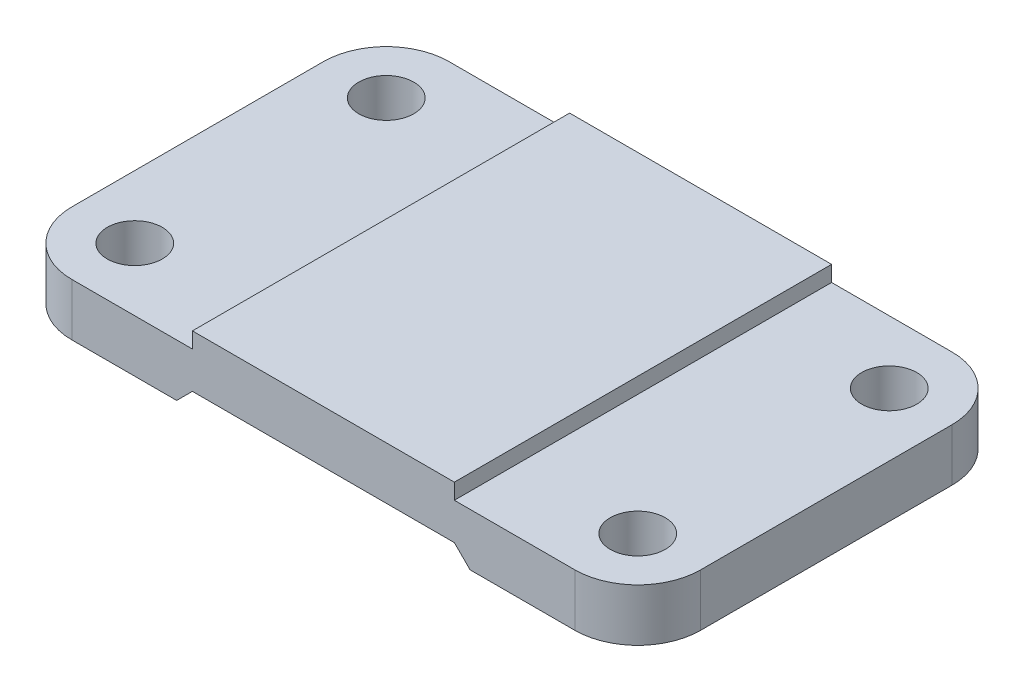
ISO-10303-21;
HEADER;
FILE_DESCRIPTION(('STEP AP214'),'2;1');
FILE_NAME('part.step','',(''),(''),'','','');
FILE_SCHEMA(('AUTOMOTIVE_DESIGN { 1 0 10303 214 1 1 1 1 }'));
ENDSEC;
DATA;
#1=APPLICATION_CONTEXT('core data for automotive mechanical design processes');
#2=APPLICATION_PROTOCOL_DEFINITION('international standard','automotive_design',2000,#1);
#3=PRODUCT_CONTEXT('',#1,'mechanical');
#4=PRODUCT('Part','Part','',(#3));
#5=PRODUCT_RELATED_PRODUCT_CATEGORY('part','',(#4));
#6=PRODUCT_DEFINITION_FORMATION('','',#4);
#7=PRODUCT_DEFINITION_CONTEXT('part definition',#1,'design');
#8=PRODUCT_DEFINITION('design','',#6,#7);
#9=PRODUCT_DEFINITION_SHAPE('','',#8);
#10=(LENGTH_UNIT() NAMED_UNIT(*) SI_UNIT(.MILLI.,.METRE.));
#11=(NAMED_UNIT(*) PLANE_ANGLE_UNIT() SI_UNIT($,.RADIAN.));
#12=(NAMED_UNIT(*) SI_UNIT($,.STERADIAN.) SOLID_ANGLE_UNIT());
#13=UNCERTAINTY_MEASURE_WITH_UNIT(LENGTH_MEASURE(1.E-05),#10,'distance_accuracy_value','');
#14=(GEOMETRIC_REPRESENTATION_CONTEXT(3) GLOBAL_UNCERTAINTY_ASSIGNED_CONTEXT((#13)) GLOBAL_UNIT_ASSIGNED_CONTEXT((#10,
#11,#12)) REPRESENTATION_CONTEXT('',''));
#15=CARTESIAN_POINT('',(0.,0.,0.));
#16=DIRECTION('',(0.,0.,1.));
#17=DIRECTION('',(1.,0.,0.));
#18=AXIS2_PLACEMENT_3D('',#15,#16,#17);
#19=CARTESIAN_POINT('',(-25.,0.,-36.));
#20=DIRECTION('',(1.,0.,0.));
#21=DIRECTION('',(0.,0.,-1.));
#22=AXIS2_PLACEMENT_3D('',#19,#20,#21);
#23=PLANE('',#22);
#24=DIRECTION('',(0.,0.,1.));
#25=VECTOR('',#24,1.);
#26=CARTESIAN_POINT('',(-25.,4.99999999999998,-36.));
#27=LINE('',#26,#25);
#28=CARTESIAN_POINT('',(-25.,4.99999999999998,-36.));
#29=VERTEX_POINT('',#28);
#30=CARTESIAN_POINT('',(-25.,4.99999999999998,36.));
#31=VERTEX_POINT('',#30);
#32=EDGE_CURVE('E157',#29,#31,#27,.T.);
#33=ORIENTED_EDGE('',*,*,#32,.T.);
#34=DIRECTION('',(0.,1.,0.));
#35=VECTOR('',#34,1.);
#36=CARTESIAN_POINT('',(-25.,0.,36.));
#37=LINE('',#36,#35);
#38=CARTESIAN_POINT('',(-25.,7.99999999999995,36.));
#39=VERTEX_POINT('',#38);
#40=EDGE_CURVE('E167',#31,#39,#37,.T.);
#41=ORIENTED_EDGE('',*,*,#40,.T.);
#42=DIRECTION('',(0.,0.,1.));
#43=VECTOR('',#42,1.);
#44=CARTESIAN_POINT('',(-25.,7.99999999999995,-36.));
#45=LINE('',#44,#43);
#46=CARTESIAN_POINT('',(-25.,7.99999999999995,-36.));
#47=VERTEX_POINT('',#46);
#48=EDGE_CURVE('E229',#47,#39,#45,.T.);
#49=ORIENTED_EDGE('',*,*,#48,.F.);
#50=DIRECTION('',(0.,1.,0.));
#51=VECTOR('',#50,1.);
#52=CARTESIAN_POINT('',(-25.,0.,-36.));
#53=LINE('',#52,#51);
#54=EDGE_CURVE('E174',#29,#47,#53,.T.);
#55=ORIENTED_EDGE('',*,*,#54,.F.);
#56=EDGE_LOOP('',(#33,#41,#49,#55));
#57=FACE_BOUND('',#56,.T.);
#58=ADVANCED_FACE('F40',(#57),#23,.F.);
#59=CARTESIAN_POINT('',(0.,7.99999999999996,-36.));
#60=DIRECTION('',(0.,-1.,0.));
#61=DIRECTION('',(0.,0.,-1.));
#62=AXIS2_PLACEMENT_3D('',#59,#60,#61);
#63=PLANE('',#62);
#64=ORIENTED_EDGE('',*,*,#48,.T.);
#65=DIRECTION('',(1.,0.,0.));
#66=VECTOR('',#65,1.);
#67=CARTESIAN_POINT('',(0.,7.99999999999996,36.));
#68=LINE('',#67,#66);
#69=CARTESIAN_POINT('',(25.,7.99999999999996,36.));
#70=VERTEX_POINT('',#69);
#71=EDGE_CURVE('E181',#39,#70,#68,.T.);
#72=ORIENTED_EDGE('',*,*,#71,.T.);
#73=DIRECTION('',(0.,0.,1.));
#74=VECTOR('',#73,1.);
#75=CARTESIAN_POINT('',(25.,7.99999999999996,-36.));
#76=LINE('',#75,#74);
#77=CARTESIAN_POINT('',(25.,7.99999999999996,-36.));
#78=VERTEX_POINT('',#77);
#79=EDGE_CURVE('E232',#78,#70,#76,.T.);
#80=ORIENTED_EDGE('',*,*,#79,.F.);
#81=DIRECTION('',(1.,0.,0.));
#82=VECTOR('',#81,1.);
#83=CARTESIAN_POINT('',(0.,7.99999999999996,-36.));
#84=LINE('',#83,#82);
#85=EDGE_CURVE('E176',#47,#78,#84,.T.);
#86=ORIENTED_EDGE('',*,*,#85,.F.);
#87=EDGE_LOOP('',(#64,#72,#80,#86));
#88=FACE_BOUND('',#87,.T.);
#89=ADVANCED_FACE('F305',(#88),#63,.F.);
#90=CARTESIAN_POINT('',(25.,0.,-36.));
#91=DIRECTION('',(1.,0.,0.));
#92=DIRECTION('',(0.,0.,-1.));
#93=AXIS2_PLACEMENT_3D('',#90,#91,#92);
#94=PLANE('',#93);
#95=ORIENTED_EDGE('',*,*,#79,.T.);
#96=DIRECTION('',(0.,1.,0.));
#97=VECTOR('',#96,1.);
#98=CARTESIAN_POINT('',(25.,0.,36.));
#99=LINE('',#98,#97);
#100=CARTESIAN_POINT('',(25.,4.99999999999998,36.));
#101=VERTEX_POINT('',#100);
#102=EDGE_CURVE('E204',#101,#70,#99,.T.);
#103=ORIENTED_EDGE('',*,*,#102,.F.);
#104=DIRECTION('',(0.,0.,1.));
#105=VECTOR('',#104,1.);
#106=CARTESIAN_POINT('',(25.,4.99999999999998,-36.));
#107=LINE('',#106,#105);
#108=CARTESIAN_POINT('',(25.,4.99999999999998,-36.));
#109=VERTEX_POINT('',#108);
#110=EDGE_CURVE('E234',#109,#101,#107,.T.);
#111=ORIENTED_EDGE('',*,*,#110,.F.);
#112=DIRECTION('',(0.,1.,0.));
#113=VECTOR('',#112,1.);
#114=CARTESIAN_POINT('',(25.,0.,-36.));
#115=LINE('',#114,#113);
#116=EDGE_CURVE('E225',#109,#78,#115,.T.);
#117=ORIENTED_EDGE('',*,*,#116,.T.);
#118=EDGE_LOOP('',(#95,#103,#111,#117));
#119=FACE_BOUND('',#118,.T.);
#120=ADVANCED_FACE('F302',(#119),#94,.T.);
#121=CARTESIAN_POINT('',(0.,5.,-36.));
#122=DIRECTION('',(0.,1.,0.));
#123=DIRECTION('',(0.,0.,1.));
#124=AXIS2_PLACEMENT_3D('',#121,#122,#123);
#125=PLANE('',#124);
#126=CARTESIAN_POINT('',(48.,4.99999999999995,-24.));
#127=DIRECTION('',(0.,1.,0.));
#128=DIRECTION('',(0.,0.,1.));
#129=AXIS2_PLACEMENT_3D('',#126,#127,#128);
#130=CIRCLE('',#129,5.25);
#131=CARTESIAN_POINT('',(48.,4.99999999999995,-18.75));
#132=VERTEX_POINT('',#131);
#133=EDGE_CURVE('E592',#132,#132,#130,.T.);
#134=ORIENTED_EDGE('',*,*,#133,.F.);
#135=EDGE_LOOP('',(#134));
#136=FACE_BOUND('',#135,.T.);
#137=CARTESIAN_POINT('',(48.,4.99999999999995,24.));
#138=DIRECTION('',(0.,1.,0.));
#139=DIRECTION('',(0.,0.,1.));
#140=AXIS2_PLACEMENT_3D('',#137,#138,#139);
#141=CIRCLE('',#140,5.25);
#142=CARTESIAN_POINT('',(48.,4.99999999999995,29.25));
#143=VERTEX_POINT('',#142);
#144=EDGE_CURVE('E185',#143,#143,#141,.T.);
#145=ORIENTED_EDGE('',*,*,#144,.F.);
#146=EDGE_LOOP('',(#145));
#147=FACE_BOUND('',#146,.T.);
#148=DIRECTION('',(0.,0.,1.));
#149=VECTOR('',#148,1.);
#150=CARTESIAN_POINT('',(60.,5.,-36.));
#151=LINE('',#150,#149);
#152=CARTESIAN_POINT('',(60.,5.,-24.));
#153=VERTEX_POINT('',#152);
#154=CARTESIAN_POINT('',(60.,5.,24.));
#155=VERTEX_POINT('',#154);
#156=EDGE_CURVE('E237',#153,#155,#151,.T.);
#157=ORIENTED_EDGE('',*,*,#156,.F.);
#158=CARTESIAN_POINT('',(48.,5.,-24.));
#159=DIRECTION('',(0.,1.,0.));
#160=DIRECTION('',(0.,0.,1.));
#161=AXIS2_PLACEMENT_3D('',#158,#159,#160);
#162=CIRCLE('',#161,12.);
#163=CARTESIAN_POINT('',(48.,5.,-36.));
#164=VERTEX_POINT('',#163);
#165=EDGE_CURVE('E11',#153,#164,#162,.T.);
#166=ORIENTED_EDGE('',*,*,#165,.T.);
#167=DIRECTION('',(-1.,0.,0.));
#168=VECTOR('',#167,1.);
#169=CARTESIAN_POINT('',(0.,5.,-36.));
#170=LINE('',#169,#168);
#171=EDGE_CURVE('E223',#164,#109,#170,.T.);
#172=ORIENTED_EDGE('',*,*,#171,.T.);
#173=ORIENTED_EDGE('',*,*,#110,.T.);
#174=DIRECTION('',(-1.,0.,0.));
#175=VECTOR('',#174,1.);
#176=CARTESIAN_POINT('',(0.,5.,36.));
#177=LINE('',#176,#175);
#178=CARTESIAN_POINT('',(48.,5.,36.));
#179=VERTEX_POINT('',#178);
#180=EDGE_CURVE('E202',#179,#101,#177,.T.);
#181=ORIENTED_EDGE('',*,*,#180,.F.);
#182=CARTESIAN_POINT('',(48.,5.,24.));
#183=DIRECTION('',(0.,1.,0.));
#184=DIRECTION('',(0.,0.,1.));
#185=AXIS2_PLACEMENT_3D('',#182,#183,#184);
#186=CIRCLE('',#185,12.);
#187=EDGE_CURVE('E48',#179,#155,#186,.T.);
#188=ORIENTED_EDGE('',*,*,#187,.T.);
#189=EDGE_LOOP('',(#157,#166,#172,#173,#181,#188));
#190=FACE_BOUND('',#189,.T.);
#191=ADVANCED_FACE('F299',(#136,#147,#190),#125,.T.);
#192=CARTESIAN_POINT('',(60.,0.,-36.));
#193=DIRECTION('',(-1.,0.,0.));
#194=DIRECTION('',(0.,0.,1.));
#195=AXIS2_PLACEMENT_3D('',#192,#193,#194);
#196=PLANE('',#195);
#197=DIRECTION('',(0.,0.,1.));
#198=VECTOR('',#197,1.);
#199=CARTESIAN_POINT('',(60.,-5.,-36.));
#200=LINE('',#199,#198);
#201=CARTESIAN_POINT('',(60.,-5.,-24.));
#202=VERTEX_POINT('',#201);
#203=CARTESIAN_POINT('',(60.,-5.,24.));
#204=VERTEX_POINT('',#203);
#205=EDGE_CURVE('E239',#202,#204,#200,.T.);
#206=ORIENTED_EDGE('',*,*,#205,.F.);
#207=DIRECTION('',(0.,-1.,0.));
#208=VECTOR('',#207,1.);
#209=CARTESIAN_POINT('',(60.,0.,-24.));
#210=LINE('',#209,#208);
#211=EDGE_CURVE('E61',#202,#153,#210,.F.);
#212=ORIENTED_EDGE('',*,*,#211,.T.);
#213=ORIENTED_EDGE('',*,*,#156,.T.);
#214=DIRECTION('',(0.,-1.,0.));
#215=VECTOR('',#214,1.);
#216=CARTESIAN_POINT('',(60.,-5.,24.));
#217=LINE('',#216,#215);
#218=EDGE_CURVE('E279',#155,#204,#217,.T.);
#219=ORIENTED_EDGE('',*,*,#218,.T.);
#220=EDGE_LOOP('',(#206,#212,#213,#219));
#221=FACE_BOUND('',#220,.T.);
#222=ADVANCED_FACE('F283',(#221),#196,.F.);
#223=CARTESIAN_POINT('',(0.,-5.,-36.));
#224=DIRECTION('',(0.,1.,0.));
#225=DIRECTION('',(0.,0.,1.));
#226=AXIS2_PLACEMENT_3D('',#223,#224,#225);
#227=PLANE('',#226);
#228=CARTESIAN_POINT('',(48.,-5.00000000000004,-24.));
#229=DIRECTION('',(0.,1.,0.));
#230=DIRECTION('',(0.,0.,1.));
#231=AXIS2_PLACEMENT_3D('',#228,#229,#230);
#232=CIRCLE('',#231,5.25);
#233=CARTESIAN_POINT('',(48.,-5.00000000000004,-18.75));
#234=VERTEX_POINT('',#233);
#235=EDGE_CURVE('E595',#234,#234,#232,.T.);
#236=ORIENTED_EDGE('',*,*,#235,.T.);
#237=EDGE_LOOP('',(#236));
#238=FACE_BOUND('',#237,.T.);
#239=CARTESIAN_POINT('',(48.,-5.00000000000004,24.));
#240=DIRECTION('',(0.,1.,0.));
#241=DIRECTION('',(0.,0.,1.));
#242=AXIS2_PLACEMENT_3D('',#239,#240,#241);
#243=CIRCLE('',#242,5.25);
#244=CARTESIAN_POINT('',(48.,-5.00000000000004,29.25));
#245=VERTEX_POINT('',#244);
#246=EDGE_CURVE('E182',#245,#245,#243,.T.);
#247=ORIENTED_EDGE('',*,*,#246,.T.);
#248=EDGE_LOOP('',(#247));
#249=FACE_BOUND('',#248,.T.);
#250=DIRECTION('',(-1.,0.,0.));
#251=VECTOR('',#250,1.);
#252=CARTESIAN_POINT('',(0.,-5.,-36.));
#253=LINE('',#252,#251);
#254=CARTESIAN_POINT('',(48.,-5.,-36.));
#255=VERTEX_POINT('',#254);
#256=CARTESIAN_POINT('',(28.,-5.,-36.));
#257=VERTEX_POINT('',#256);
#258=EDGE_CURVE('E221',#255,#257,#253,.T.);
#259=ORIENTED_EDGE('',*,*,#258,.F.);
#260=CARTESIAN_POINT('',(48.,-5.,-24.));
#261=DIRECTION('',(0.,1.,0.));
#262=DIRECTION('',(0.,0.,1.));
#263=AXIS2_PLACEMENT_3D('',#260,#261,#262);
#264=CIRCLE('',#263,12.);
#265=EDGE_CURVE('E277',#255,#202,#264,.F.);
#266=ORIENTED_EDGE('',*,*,#265,.T.);
#267=ORIENTED_EDGE('',*,*,#205,.T.);
#268=CARTESIAN_POINT('',(48.,-5.,24.));
#269=DIRECTION('',(0.,1.,0.));
#270=DIRECTION('',(0.,0.,1.));
#271=AXIS2_PLACEMENT_3D('',#268,#269,#270);
#272=CIRCLE('',#271,12.);
#273=CARTESIAN_POINT('',(48.,-5.,36.));
#274=VERTEX_POINT('',#273);
#275=EDGE_CURVE('E275',#204,#274,#272,.F.);
#276=ORIENTED_EDGE('',*,*,#275,.T.);
#277=DIRECTION('',(-1.,0.,0.));
#278=VECTOR('',#277,1.);
#279=CARTESIAN_POINT('',(0.,-5.,36.));
#280=LINE('',#279,#278);
#281=CARTESIAN_POINT('',(28.,-5.,36.));
#282=VERTEX_POINT('',#281);
#283=EDGE_CURVE('E200',#274,#282,#280,.T.);
#284=ORIENTED_EDGE('',*,*,#283,.T.);
#285=DIRECTION('',(0.,0.,1.));
#286=VECTOR('',#285,1.);
#287=CARTESIAN_POINT('',(28.,-5.,-36.));
#288=LINE('',#287,#286);
#289=EDGE_CURVE('E242',#257,#282,#288,.T.);
#290=ORIENTED_EDGE('',*,*,#289,.F.);
#291=EDGE_LOOP('',(#259,#266,#267,#276,#284,#290));
#292=FACE_BOUND('',#291,.T.);
#293=ADVANCED_FACE('F287',(#238,#249,#292),#227,.F.);
#294=CARTESIAN_POINT('',(11.5,11.5,-36.));
#295=DIRECTION('',(0.707106781186548,0.707106781186547,0.));
#296=DIRECTION('',(-0.707106781186547,0.707106781186548,0.));
#297=AXIS2_PLACEMENT_3D('',#294,#295,#296);
#298=PLANE('',#297);
#299=ORIENTED_EDGE('',*,*,#289,.T.);
#300=DIRECTION('',(-0.707106781186547,0.707106781186548,0.));
#301=VECTOR('',#300,1.);
#302=CARTESIAN_POINT('',(11.5,11.5,36.));
#303=LINE('',#302,#301);
#304=CARTESIAN_POINT('',(25.,-1.99999999999999,36.));
#305=VERTEX_POINT('',#304);
#306=EDGE_CURVE('E197',#282,#305,#303,.T.);
#307=ORIENTED_EDGE('',*,*,#306,.T.);
#308=DIRECTION('',(0.,0.,1.));
#309=VECTOR('',#308,1.);
#310=CARTESIAN_POINT('',(25.,-1.99999999999999,-36.));
#311=LINE('',#310,#309);
#312=CARTESIAN_POINT('',(25.,-1.99999999999999,-36.));
#313=VERTEX_POINT('',#312);
#314=EDGE_CURVE('E245',#313,#305,#311,.T.);
#315=ORIENTED_EDGE('',*,*,#314,.F.);
#316=DIRECTION('',(-0.707106781186547,0.707106781186548,0.));
#317=VECTOR('',#316,1.);
#318=CARTESIAN_POINT('',(11.5,11.5,-36.));
#319=LINE('',#318,#317);
#320=EDGE_CURVE('E219',#257,#313,#319,.T.);
#321=ORIENTED_EDGE('',*,*,#320,.F.);
#322=EDGE_LOOP('',(#299,#307,#315,#321));
#323=FACE_BOUND('',#322,.T.);
#324=ADVANCED_FACE('F332',(#323),#298,.F.);
#325=CARTESIAN_POINT('',(0.,-1.99999999999999,-36.));
#326=DIRECTION('',(0.,-1.,0.));
#327=DIRECTION('',(1.,0.,0.));
#328=AXIS2_PLACEMENT_3D('',#325,#326,#327);
#329=PLANE('',#328);
#330=ORIENTED_EDGE('',*,*,#314,.T.);
#331=DIRECTION('',(1.,0.,0.));
#332=VECTOR('',#331,1.);
#333=CARTESIAN_POINT('',(0.,-1.99999999999999,36.));
#334=LINE('',#333,#332);
#335=CARTESIAN_POINT('',(-25.,-1.99999999999999,36.));
#336=VERTEX_POINT('',#335);
#337=EDGE_CURVE('E194',#336,#305,#334,.T.);
#338=ORIENTED_EDGE('',*,*,#337,.F.);
#339=DIRECTION('',(0.,0.,1.));
#340=VECTOR('',#339,1.);
#341=CARTESIAN_POINT('',(-25.,-1.99999999999999,-36.));
#342=LINE('',#341,#340);
#343=CARTESIAN_POINT('',(-25.,-1.99999999999999,-36.));
#344=VERTEX_POINT('',#343);
#345=EDGE_CURVE('E247',#344,#336,#342,.T.);
#346=ORIENTED_EDGE('',*,*,#345,.F.);
#347=DIRECTION('',(1.,0.,0.));
#348=VECTOR('',#347,1.);
#349=CARTESIAN_POINT('',(0.,-1.99999999999999,-36.));
#350=LINE('',#349,#348);
#351=EDGE_CURVE('E216',#344,#313,#350,.T.);
#352=ORIENTED_EDGE('',*,*,#351,.T.);
#353=EDGE_LOOP('',(#330,#338,#346,#352));
#354=FACE_BOUND('',#353,.T.);
#355=ADVANCED_FACE('F327',(#354),#329,.T.);
#356=CARTESIAN_POINT('',(-11.5000000000001,11.5,-36.));
#357=DIRECTION('',(0.707106781186549,-0.707106781186546,0.));
#358=DIRECTION('',(0.707106781186546,0.707106781186549,0.));
#359=AXIS2_PLACEMENT_3D('',#356,#357,#358);
#360=PLANE('',#359);
#361=ORIENTED_EDGE('',*,*,#345,.T.);
#362=DIRECTION('',(0.707106781186546,0.707106781186549,0.));
#363=VECTOR('',#362,1.);
#364=CARTESIAN_POINT('',(-11.5000000000001,11.5,36.));
#365=LINE('',#364,#363);
#366=CARTESIAN_POINT('',(-28.,-5.,36.));
#367=VERTEX_POINT('',#366);
#368=EDGE_CURVE('E191',#367,#336,#365,.T.);
#369=ORIENTED_EDGE('',*,*,#368,.F.);
#370=DIRECTION('',(0.,0.,1.));
#371=VECTOR('',#370,1.);
#372=CARTESIAN_POINT('',(-28.,-5.,-36.));
#373=LINE('',#372,#371);
#374=CARTESIAN_POINT('',(-28.,-5.,-36.));
#375=VERTEX_POINT('',#374);
#376=EDGE_CURVE('E249',#375,#367,#373,.T.);
#377=ORIENTED_EDGE('',*,*,#376,.F.);
#378=DIRECTION('',(0.707106781186546,0.707106781186549,0.));
#379=VECTOR('',#378,1.);
#380=CARTESIAN_POINT('',(-11.5000000000001,11.5,-36.));
#381=LINE('',#380,#379);
#382=EDGE_CURVE('E213',#375,#344,#381,.T.);
#383=ORIENTED_EDGE('',*,*,#382,.T.);
#384=EDGE_LOOP('',(#361,#369,#377,#383));
#385=FACE_BOUND('',#384,.T.);
#386=ADVANCED_FACE('F405',(#385),#360,.T.);
#387=CARTESIAN_POINT('',(0.,-5.,-36.));
#388=DIRECTION('',(0.,1.,0.));
#389=DIRECTION('',(0.,0.,1.));
#390=AXIS2_PLACEMENT_3D('',#387,#388,#389);
#391=PLANE('',#390);
#392=CARTESIAN_POINT('',(-48.,-5.,24.));
#393=DIRECTION('',(0.,1.,0.));
#394=DIRECTION('',(0.,0.,1.));
#395=AXIS2_PLACEMENT_3D('',#392,#393,#394);
#396=CIRCLE('',#395,5.25);
#397=CARTESIAN_POINT('',(-48.,-5.,29.25));
#398=VERTEX_POINT('',#397);
#399=EDGE_CURVE('E579',#398,#398,#396,.T.);
#400=ORIENTED_EDGE('',*,*,#399,.T.);
#401=EDGE_LOOP('',(#400));
#402=FACE_BOUND('',#401,.T.);
#403=CARTESIAN_POINT('',(-48.,-5.,-24.));
#404=DIRECTION('',(0.,1.,0.));
#405=DIRECTION('',(0.,0.,1.));
#406=AXIS2_PLACEMENT_3D('',#403,#404,#405);
#407=CIRCLE('',#406,5.25);
#408=CARTESIAN_POINT('',(-48.,-5.,-18.75));
#409=VERTEX_POINT('',#408);
#410=EDGE_CURVE('E589',#409,#409,#407,.T.);
#411=ORIENTED_EDGE('',*,*,#410,.T.);
#412=EDGE_LOOP('',(#411));
#413=FACE_BOUND('',#412,.T.);
#414=DIRECTION('',(0.,0.,1.));
#415=VECTOR('',#414,1.);
#416=CARTESIAN_POINT('',(-60.,-5.,-36.));
#417=LINE('',#416,#415);
#418=CARTESIAN_POINT('',(-60.,-5.,-24.));
#419=VERTEX_POINT('',#418);
#420=CARTESIAN_POINT('',(-60.,-5.,24.));
#421=VERTEX_POINT('',#420);
#422=EDGE_CURVE('E251',#419,#421,#417,.T.);
#423=ORIENTED_EDGE('',*,*,#422,.F.);
#424=CARTESIAN_POINT('',(-48.,-5.,-24.));
#425=DIRECTION('',(0.,1.,0.));
#426=DIRECTION('',(0.,0.,1.));
#427=AXIS2_PLACEMENT_3D('',#424,#425,#426);
#428=CIRCLE('',#427,12.);
#429=CARTESIAN_POINT('',(-48.,-5.,-36.));
#430=VERTEX_POINT('',#429);
#431=EDGE_CURVE('E261',#419,#430,#428,.F.);
#432=ORIENTED_EDGE('',*,*,#431,.T.);
#433=DIRECTION('',(-1.,0.,0.));
#434=VECTOR('',#433,1.);
#435=CARTESIAN_POINT('',(0.,-5.,-36.));
#436=LINE('',#435,#434);
#437=EDGE_CURVE('E210',#375,#430,#436,.T.);
#438=ORIENTED_EDGE('',*,*,#437,.F.);
#439=ORIENTED_EDGE('',*,*,#376,.T.);
#440=DIRECTION('',(-1.,0.,0.));
#441=VECTOR('',#440,1.);
#442=CARTESIAN_POINT('',(0.,-5.,36.));
#443=LINE('',#442,#441);
#444=CARTESIAN_POINT('',(-48.,-5.,36.));
#445=VERTEX_POINT('',#444);
#446=EDGE_CURVE('E166',#367,#445,#443,.T.);
#447=ORIENTED_EDGE('',*,*,#446,.T.);
#448=CARTESIAN_POINT('',(-48.,-5.,24.));
#449=DIRECTION('',(0.,1.,0.));
#450=DIRECTION('',(0.,0.,1.));
#451=AXIS2_PLACEMENT_3D('',#448,#449,#450);
#452=CIRCLE('',#451,12.);
#453=EDGE_CURVE('E259',#445,#421,#452,.F.);
#454=ORIENTED_EDGE('',*,*,#453,.T.);
#455=EDGE_LOOP('',(#423,#432,#438,#439,#447,#454));
#456=FACE_BOUND('',#455,.T.);
#457=ADVANCED_FACE('F317',(#402,#413,#456),#391,.F.);
#458=CARTESIAN_POINT('',(-60.,0.,-36.));
#459=DIRECTION('',(-1.,0.,0.));
#460=DIRECTION('',(0.,0.,1.));
#461=AXIS2_PLACEMENT_3D('',#458,#459,#460);
#462=PLANE('',#461);
#463=DIRECTION('',(0.,0.,1.));
#464=VECTOR('',#463,1.);
#465=CARTESIAN_POINT('',(-60.,5.,-36.));
#466=LINE('',#465,#464);
#467=CARTESIAN_POINT('',(-60.,5.,-24.));
#468=VERTEX_POINT('',#467);
#469=CARTESIAN_POINT('',(-60.,5.,24.));
#470=VERTEX_POINT('',#469);
#471=EDGE_CURVE('E175',#468,#470,#466,.T.);
#472=ORIENTED_EDGE('',*,*,#471,.F.);
#473=DIRECTION('',(0.,-1.,0.));
#474=VECTOR('',#473,1.);
#475=CARTESIAN_POINT('',(-60.,-5.,-24.));
#476=LINE('',#475,#474);
#477=EDGE_CURVE('E256',#468,#419,#476,.T.);
#478=ORIENTED_EDGE('',*,*,#477,.T.);
#479=ORIENTED_EDGE('',*,*,#422,.T.);
#480=DIRECTION('',(0.,-1.,0.));
#481=VECTOR('',#480,1.);
#482=CARTESIAN_POINT('',(-60.,0.,24.));
#483=LINE('',#482,#481);
#484=EDGE_CURVE('E231',#421,#470,#483,.F.);
#485=ORIENTED_EDGE('',*,*,#484,.T.);
#486=EDGE_LOOP('',(#472,#478,#479,#485));
#487=FACE_BOUND('',#486,.T.);
#488=ADVANCED_FACE('F314',(#487),#462,.T.);
#489=CARTESIAN_POINT('',(0.,4.99999999999997,-36.));
#490=DIRECTION('',(0.,-1.,0.));
#491=DIRECTION('',(1.,0.,0.));
#492=AXIS2_PLACEMENT_3D('',#489,#490,#491);
#493=PLANE('',#492);
#494=CARTESIAN_POINT('',(-48.,4.99999999999998,24.));
#495=DIRECTION('',(0.,1.,0.));
#496=DIRECTION('',(0.,0.,1.));
#497=AXIS2_PLACEMENT_3D('',#494,#495,#496);
#498=CIRCLE('',#497,5.25);
#499=CARTESIAN_POINT('',(-48.,4.99999999999998,29.25));
#500=VERTEX_POINT('',#499);
#501=EDGE_CURVE('E582',#500,#500,#498,.T.);
#502=ORIENTED_EDGE('',*,*,#501,.F.);
#503=EDGE_LOOP('',(#502));
#504=FACE_BOUND('',#503,.T.);
#505=CARTESIAN_POINT('',(-48.,4.99999999999998,-24.));
#506=DIRECTION('',(0.,1.,0.));
#507=DIRECTION('',(0.,0.,1.));
#508=AXIS2_PLACEMENT_3D('',#505,#506,#507);
#509=CIRCLE('',#508,5.25);
#510=CARTESIAN_POINT('',(-48.,4.99999999999998,-18.75));
#511=VERTEX_POINT('',#510);
#512=EDGE_CURVE('E584',#511,#511,#509,.T.);
#513=ORIENTED_EDGE('',*,*,#512,.F.);
#514=EDGE_LOOP('',(#513));
#515=FACE_BOUND('',#514,.T.);
#516=DIRECTION('',(1.,0.,0.));
#517=VECTOR('',#516,1.);
#518=CARTESIAN_POINT('',(0.,4.99999999999997,-36.));
#519=LINE('',#518,#517);
#520=CARTESIAN_POINT('',(-48.,4.99999999999998,-36.));
#521=VERTEX_POINT('',#520);
#522=EDGE_CURVE('E208',#521,#29,#519,.T.);
#523=ORIENTED_EDGE('',*,*,#522,.F.);
#524=CARTESIAN_POINT('',(-48.,4.99999999999998,-24.));
#525=DIRECTION('',(0.,-1.,0.));
#526=DIRECTION('',(1.,0.,0.));
#527=AXIS2_PLACEMENT_3D('',#524,#525,#526);
#528=CIRCLE('',#527,12.);
#529=EDGE_CURVE('E269',#521,#468,#528,.F.);
#530=ORIENTED_EDGE('',*,*,#529,.T.);
#531=ORIENTED_EDGE('',*,*,#471,.T.);
#532=CARTESIAN_POINT('',(-48.,4.99999999999998,24.));
#533=DIRECTION('',(0.,-1.,0.));
#534=DIRECTION('',(1.,0.,0.));
#535=AXIS2_PLACEMENT_3D('',#532,#533,#534);
#536=CIRCLE('',#535,12.);
#537=CARTESIAN_POINT('',(-48.,4.99999999999998,36.));
#538=VERTEX_POINT('',#537);
#539=EDGE_CURVE('E161',#470,#538,#536,.F.);
#540=ORIENTED_EDGE('',*,*,#539,.T.);
#541=DIRECTION('',(1.,0.,0.));
#542=VECTOR('',#541,1.);
#543=CARTESIAN_POINT('',(0.,4.99999999999997,36.));
#544=LINE('',#543,#542);
#545=EDGE_CURVE('E153',#538,#31,#544,.T.);
#546=ORIENTED_EDGE('',*,*,#545,.T.);
#547=ORIENTED_EDGE('',*,*,#32,.F.);
#548=EDGE_LOOP('',(#523,#530,#531,#540,#546,#547));
#549=FACE_BOUND('',#548,.T.);
#550=ADVANCED_FACE('F156',(#504,#515,#549),#493,.F.);
#551=CARTESIAN_POINT('',(0.,0.,-36.));
#552=DIRECTION('',(0.,0.,1.));
#553=DIRECTION('',(1.,0.,0.));
#554=AXIS2_PLACEMENT_3D('',#551,#552,#553);
#555=PLANE('',#554);
#556=ORIENTED_EDGE('',*,*,#437,.T.);
#557=DIRECTION('',(0.,-1.,0.));
#558=VECTOR('',#557,1.);
#559=CARTESIAN_POINT('',(-48.,5.,-36.));
#560=LINE('',#559,#558);
#561=EDGE_CURVE('E266',#430,#521,#560,.F.);
#562=ORIENTED_EDGE('',*,*,#561,.T.);
#563=ORIENTED_EDGE('',*,*,#522,.T.);
#564=ORIENTED_EDGE('',*,*,#54,.T.);
#565=ORIENTED_EDGE('',*,*,#85,.T.);
#566=ORIENTED_EDGE('',*,*,#116,.F.);
#567=ORIENTED_EDGE('',*,*,#171,.F.);
#568=DIRECTION('',(0.,-1.,0.));
#569=VECTOR('',#568,1.);
#570=CARTESIAN_POINT('',(48.,0.,-36.));
#571=LINE('',#570,#569);
#572=EDGE_CURVE('E263',#164,#255,#571,.T.);
#573=ORIENTED_EDGE('',*,*,#572,.T.);
#574=ORIENTED_EDGE('',*,*,#258,.T.);
#575=ORIENTED_EDGE('',*,*,#320,.T.);
#576=ORIENTED_EDGE('',*,*,#351,.F.);
#577=ORIENTED_EDGE('',*,*,#382,.F.);
#578=EDGE_LOOP('',(#556,#562,#563,#564,#565,#566,#567,#573,#574,#575,#576,#577));
#579=FACE_BOUND('',#578,.T.);
#580=ADVANCED_FACE('F296',(#579),#555,.F.);
#581=CARTESIAN_POINT('',(0.,0.,36.));
#582=DIRECTION('',(0.,0.,1.));
#583=DIRECTION('',(1.,0.,0.));
#584=AXIS2_PLACEMENT_3D('',#581,#582,#583);
#585=PLANE('',#584);
#586=ORIENTED_EDGE('',*,*,#545,.F.);
#587=DIRECTION('',(0.,-1.,0.));
#588=VECTOR('',#587,1.);
#589=CARTESIAN_POINT('',(-48.,0.,36.));
#590=LINE('',#589,#588);
#591=EDGE_CURVE('E273',#538,#445,#590,.T.);
#592=ORIENTED_EDGE('',*,*,#591,.T.);
#593=ORIENTED_EDGE('',*,*,#446,.F.);
#594=ORIENTED_EDGE('',*,*,#368,.T.);
#595=ORIENTED_EDGE('',*,*,#337,.T.);
#596=ORIENTED_EDGE('',*,*,#306,.F.);
#597=ORIENTED_EDGE('',*,*,#283,.F.);
#598=DIRECTION('',(0.,-1.,0.));
#599=VECTOR('',#598,1.);
#600=CARTESIAN_POINT('',(48.,5.,36.));
#601=LINE('',#600,#599);
#602=EDGE_CURVE('E271',#274,#179,#601,.F.);
#603=ORIENTED_EDGE('',*,*,#602,.T.);
#604=ORIENTED_EDGE('',*,*,#180,.T.);
#605=ORIENTED_EDGE('',*,*,#102,.T.);
#606=ORIENTED_EDGE('',*,*,#71,.F.);
#607=ORIENTED_EDGE('',*,*,#40,.F.);
#608=EDGE_LOOP('',(#586,#592,#593,#594,#595,#596,#597,#603,#604,#605,#606,#607));
#609=FACE_BOUND('',#608,.T.);
#610=ADVANCED_FACE('F178',(#609),#585,.T.);
#611=CARTESIAN_POINT('',(-48.,0.,-24.));
#612=DIRECTION('',(0.,1.,0.));
#613=DIRECTION('',(0.,0.,1.));
#614=AXIS2_PLACEMENT_3D('',#611,#612,#613);
#615=CYLINDRICAL_SURFACE('',#614,12.);
#616=ORIENTED_EDGE('',*,*,#529,.F.);
#617=ORIENTED_EDGE('',*,*,#561,.F.);
#618=ORIENTED_EDGE('',*,*,#431,.F.);
#619=ORIENTED_EDGE('',*,*,#477,.F.);
#620=EDGE_LOOP('',(#616,#617,#618,#619));
#621=FACE_BOUND('',#620,.T.);
#622=ADVANCED_FACE('F311',(#621),#615,.T.);
#623=CARTESIAN_POINT('',(-48.,0.,24.));
#624=DIRECTION('',(0.,-1.,0.));
#625=DIRECTION('',(0.,0.,-1.));
#626=AXIS2_PLACEMENT_3D('',#623,#624,#625);
#627=CYLINDRICAL_SURFACE('',#626,12.);
#628=ORIENTED_EDGE('',*,*,#539,.F.);
#629=ORIENTED_EDGE('',*,*,#484,.F.);
#630=ORIENTED_EDGE('',*,*,#453,.F.);
#631=ORIENTED_EDGE('',*,*,#591,.F.);
#632=EDGE_LOOP('',(#628,#629,#630,#631));
#633=FACE_BOUND('',#632,.T.);
#634=ADVANCED_FACE('F321',(#633),#627,.T.);
#635=CARTESIAN_POINT('',(48.,0.,-24.));
#636=DIRECTION('',(0.,-1.,0.));
#637=DIRECTION('',(0.,0.,-1.));
#638=AXIS2_PLACEMENT_3D('',#635,#636,#637);
#639=CYLINDRICAL_SURFACE('',#638,12.);
#640=ORIENTED_EDGE('',*,*,#165,.F.);
#641=ORIENTED_EDGE('',*,*,#211,.F.);
#642=ORIENTED_EDGE('',*,*,#265,.F.);
#643=ORIENTED_EDGE('',*,*,#572,.F.);
#644=EDGE_LOOP('',(#640,#641,#642,#643));
#645=FACE_BOUND('',#644,.T.);
#646=ADVANCED_FACE('F293',(#645),#639,.T.);
#647=CARTESIAN_POINT('',(48.,0.,24.));
#648=DIRECTION('',(0.,1.,0.));
#649=DIRECTION('',(0.,0.,1.));
#650=AXIS2_PLACEMENT_3D('',#647,#648,#649);
#651=CYLINDRICAL_SURFACE('',#650,12.);
#652=ORIENTED_EDGE('',*,*,#187,.F.);
#653=ORIENTED_EDGE('',*,*,#602,.F.);
#654=ORIENTED_EDGE('',*,*,#275,.F.);
#655=ORIENTED_EDGE('',*,*,#218,.F.);
#656=EDGE_LOOP('',(#652,#653,#654,#655));
#657=FACE_BOUND('',#656,.T.);
#658=ADVANCED_FACE('F42',(#657),#651,.T.);
#659=CARTESIAN_POINT('',(48.,4.99999999999995,24.));
#660=DIRECTION('',(0.,1.,0.));
#661=DIRECTION('',(0.,0.,1.));
#662=AXIS2_PLACEMENT_3D('',#659,#660,#661);
#663=CYLINDRICAL_SURFACE('',#662,5.25);
#664=ORIENTED_EDGE('',*,*,#246,.F.);
#665=EDGE_LOOP('',(#664));
#666=FACE_BOUND('',#665,.T.);
#667=ORIENTED_EDGE('',*,*,#144,.T.);
#668=EDGE_LOOP('',(#667));
#669=FACE_BOUND('',#668,.T.);
#670=ADVANCED_FACE('F335',(#666,#669),#663,.F.);
#671=CARTESIAN_POINT('',(48.,4.99999999999995,-24.));
#672=DIRECTION('',(0.,1.,0.));
#673=DIRECTION('',(0.,0.,1.));
#674=AXIS2_PLACEMENT_3D('',#671,#672,#673);
#675=CYLINDRICAL_SURFACE('',#674,5.25);
#676=ORIENTED_EDGE('',*,*,#235,.F.);
#677=EDGE_LOOP('',(#676));
#678=FACE_BOUND('',#677,.T.);
#679=ORIENTED_EDGE('',*,*,#133,.T.);
#680=EDGE_LOOP('',(#679));
#681=FACE_BOUND('',#680,.T.);
#682=ADVANCED_FACE('F340',(#678,#681),#675,.F.);
#683=CARTESIAN_POINT('',(-48.,4.99999999999998,-24.));
#684=DIRECTION('',(0.,1.,0.));
#685=DIRECTION('',(0.,0.,1.));
#686=AXIS2_PLACEMENT_3D('',#683,#684,#685);
#687=CYLINDRICAL_SURFACE('',#686,5.25);
#688=ORIENTED_EDGE('',*,*,#410,.F.);
#689=EDGE_LOOP('',(#688));
#690=FACE_BOUND('',#689,.T.);
#691=ORIENTED_EDGE('',*,*,#512,.T.);
#692=EDGE_LOOP('',(#691));
#693=FACE_BOUND('',#692,.T.);
#694=ADVANCED_FACE('F440',(#690,#693),#687,.F.);
#695=CARTESIAN_POINT('',(-48.,4.99999999999998,24.));
#696=DIRECTION('',(0.,1.,0.));
#697=DIRECTION('',(0.,0.,1.));
#698=AXIS2_PLACEMENT_3D('',#695,#696,#697);
#699=CYLINDRICAL_SURFACE('',#698,5.25);
#700=ORIENTED_EDGE('',*,*,#399,.F.);
#701=EDGE_LOOP('',(#700));
#702=FACE_BOUND('',#701,.T.);
#703=ORIENTED_EDGE('',*,*,#501,.T.);
#704=EDGE_LOOP('',(#703));
#705=FACE_BOUND('',#704,.T.);
#706=ADVANCED_FACE('F451',(#702,#705),#699,.F.);
#707=CLOSED_SHELL('',(#58,#89,#120,#191,#222,#293,#324,#355,#386,#457,#488,#550,#580,#610,#622,
#634,#646,#658,#670,#682,#694,#706));
#708=MANIFOLD_SOLID_BREP('B2',#707);
#709=ADVANCED_BREP_SHAPE_REPRESENTATION('',(#18,#708),#14);
#710=SHAPE_DEFINITION_REPRESENTATION(#9,#709);
ENDSEC;
END-ISO-10303-21;
